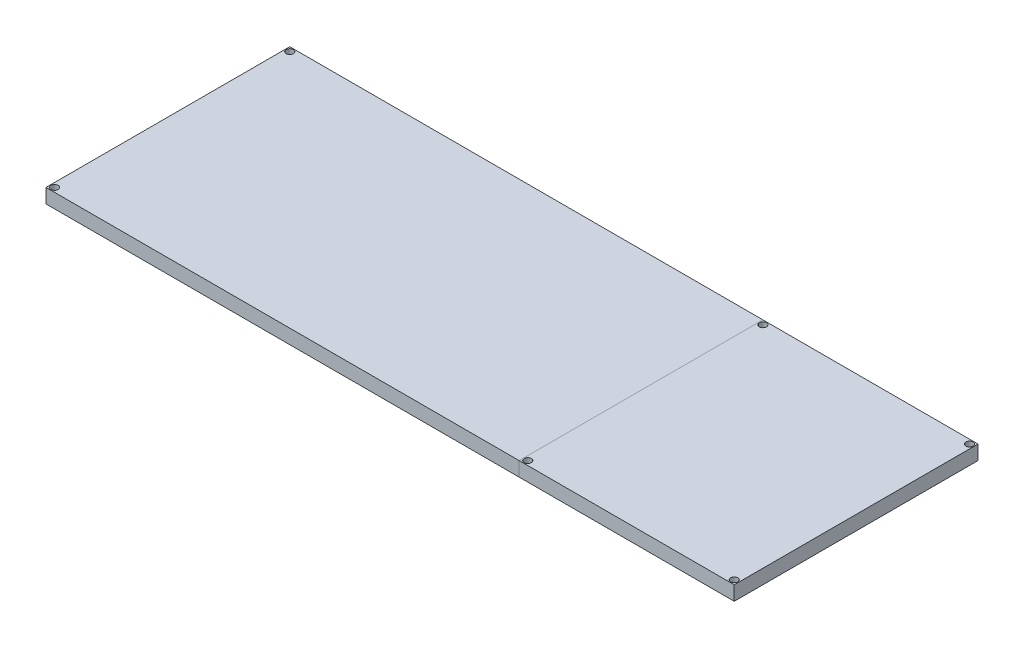
ISO-10303-21;
HEADER;
FILE_DESCRIPTION(('STEP AP214'),'2;1');
FILE_NAME('part.step','',(''),(''),'','','');
FILE_SCHEMA(('AUTOMOTIVE_DESIGN { 1 0 10303 214 1 1 1 1 }'));
ENDSEC;
DATA;
#1=APPLICATION_CONTEXT('core data for automotive mechanical design processes');
#2=APPLICATION_PROTOCOL_DEFINITION('international standard','automotive_design',2000,#1);
#3=PRODUCT_CONTEXT('',#1,'mechanical');
#4=PRODUCT('Part','Part','',(#3));
#5=PRODUCT_RELATED_PRODUCT_CATEGORY('part','',(#4));
#6=PRODUCT_DEFINITION_FORMATION('','',#4);
#7=PRODUCT_DEFINITION_CONTEXT('part definition',#1,'design');
#8=PRODUCT_DEFINITION('design','',#6,#7);
#9=PRODUCT_DEFINITION_SHAPE('','',#8);
#10=(LENGTH_UNIT() NAMED_UNIT(*) SI_UNIT(.MILLI.,.METRE.));
#11=(NAMED_UNIT(*) PLANE_ANGLE_UNIT() SI_UNIT($,.RADIAN.));
#12=(NAMED_UNIT(*) SI_UNIT($,.STERADIAN.) SOLID_ANGLE_UNIT());
#13=UNCERTAINTY_MEASURE_WITH_UNIT(LENGTH_MEASURE(1.E-05),#10,'distance_accuracy_value','');
#14=(GEOMETRIC_REPRESENTATION_CONTEXT(3) GLOBAL_UNCERTAINTY_ASSIGNED_CONTEXT((#13)) GLOBAL_UNIT_ASSIGNED_CONTEXT((#10,
#11,#12)) REPRESENTATION_CONTEXT('',''));
#15=CARTESIAN_POINT('',(0.,0.,0.));
#16=DIRECTION('',(0.,0.,1.));
#17=DIRECTION('',(1.,0.,0.));
#18=AXIS2_PLACEMENT_3D('',#15,#16,#17);
#19=CARTESIAN_POINT('',(-165.,5.,-85.));
#20=DIRECTION('',(0.,0.,1.));
#21=DIRECTION('',(1.,0.,0.));
#22=AXIS2_PLACEMENT_3D('',#19,#20,#21);
#23=PLANE('',#22);
#24=DIRECTION('',(0.,-1.,0.));
#25=VECTOR('',#24,1.);
#26=CARTESIAN_POINT('',(0.,5.,-85.));
#27=LINE('',#26,#25);
#28=CARTESIAN_POINT('',(0.,5.,-85.));
#29=VERTEX_POINT('',#28);
#30=CARTESIAN_POINT('',(0.,0.,-85.));
#31=VERTEX_POINT('',#30);
#32=EDGE_CURVE('E111',#29,#31,#27,.T.);
#33=ORIENTED_EDGE('',*,*,#32,.T.);
#34=DIRECTION('',(1.,0.,0.));
#35=VECTOR('',#34,1.);
#36=CARTESIAN_POINT('',(-165.,0.,-85.));
#37=LINE('',#36,#35);
#38=CARTESIAN_POINT('',(-165.,0.,-85.));
#39=VERTEX_POINT('',#38);
#40=EDGE_CURVE('E12',#39,#31,#37,.T.);
#41=ORIENTED_EDGE('',*,*,#40,.F.);
#42=DIRECTION('',(0.,-1.,0.));
#43=VECTOR('',#42,1.);
#44=CARTESIAN_POINT('',(-165.,5.,-85.));
#45=LINE('',#44,#43);
#46=CARTESIAN_POINT('',(-165.,5.,-85.));
#47=VERTEX_POINT('',#46);
#48=EDGE_CURVE('E99',#47,#39,#45,.T.);
#49=ORIENTED_EDGE('',*,*,#48,.F.);
#50=DIRECTION('',(1.,0.,0.));
#51=VECTOR('',#50,1.);
#52=CARTESIAN_POINT('',(-165.,5.,-85.));
#53=LINE('',#52,#51);
#54=EDGE_CURVE('E107',#47,#29,#53,.T.);
#55=ORIENTED_EDGE('',*,*,#54,.T.);
#56=EDGE_LOOP('',(#33,#41,#49,#55));
#57=FACE_BOUND('',#56,.T.);
#58=ADVANCED_FACE('F48',(#57),#23,.F.);
#59=CARTESIAN_POINT('',(-165.,0.,-85.));
#60=DIRECTION('',(0.,1.,0.));
#61=DIRECTION('',(0.,0.,1.));
#62=AXIS2_PLACEMENT_3D('',#59,#60,#61);
#63=PLANE('',#62);
#64=CARTESIAN_POINT('',(-163.5,0.,-1.5));
#65=DIRECTION('',(0.,1.,0.));
#66=DIRECTION('',(0.,0.,1.));
#67=AXIS2_PLACEMENT_3D('',#64,#65,#66);
#68=CIRCLE('',#67,1.25000000000001);
#69=CARTESIAN_POINT('',(-163.5,0.,-0.24999999999999));
#70=VERTEX_POINT('',#69);
#71=EDGE_CURVE('E114',#70,#70,#68,.T.);
#72=ORIENTED_EDGE('',*,*,#71,.T.);
#73=EDGE_LOOP('',(#72));
#74=FACE_BOUND('',#73,.T.);
#75=CARTESIAN_POINT('',(-163.5,0.,-83.5));
#76=DIRECTION('',(0.,1.,0.));
#77=DIRECTION('',(0.,0.,1.));
#78=AXIS2_PLACEMENT_3D('',#75,#76,#77);
#79=CIRCLE('',#78,1.25000000000001);
#80=CARTESIAN_POINT('',(-163.5,0.,-82.25));
#81=VERTEX_POINT('',#80);
#82=EDGE_CURVE('E128',#81,#81,#79,.T.);
#83=ORIENTED_EDGE('',*,*,#82,.T.);
#84=EDGE_LOOP('',(#83));
#85=FACE_BOUND('',#84,.T.);
#86=DIRECTION('',(0.,0.,1.));
#87=VECTOR('',#86,1.);
#88=CARTESIAN_POINT('',(0.,0.,-85.));
#89=LINE('',#88,#87);
#90=CARTESIAN_POINT('',(0.,0.,0.));
#91=VERTEX_POINT('',#90);
#92=EDGE_CURVE('E103',#31,#91,#89,.T.);
#93=ORIENTED_EDGE('',*,*,#92,.T.);
#94=DIRECTION('',(1.,0.,0.));
#95=VECTOR('',#94,1.);
#96=CARTESIAN_POINT('',(-165.,0.,0.));
#97=LINE('',#96,#95);
#98=CARTESIAN_POINT('',(-165.,0.,0.));
#99=VERTEX_POINT('',#98);
#100=EDGE_CURVE('E56',#99,#91,#97,.T.);
#101=ORIENTED_EDGE('',*,*,#100,.F.);
#102=DIRECTION('',(0.,0.,1.));
#103=VECTOR('',#102,1.);
#104=CARTESIAN_POINT('',(-165.,0.,-85.));
#105=LINE('',#104,#103);
#106=EDGE_CURVE('E94',#39,#99,#105,.T.);
#107=ORIENTED_EDGE('',*,*,#106,.F.);
#108=ORIENTED_EDGE('',*,*,#40,.T.);
#109=EDGE_LOOP('',(#93,#101,#107,#108));
#110=FACE_BOUND('',#109,.T.);
#111=ADVANCED_FACE('F102',(#74,#85,#110),#63,.F.);
#112=CARTESIAN_POINT('',(-165.,5.,0.));
#113=DIRECTION('',(0.,0.,-1.));
#114=DIRECTION('',(-1.,0.,0.));
#115=AXIS2_PLACEMENT_3D('',#112,#113,#114);
#116=PLANE('',#115);
#117=DIRECTION('',(0.,1.,0.));
#118=VECTOR('',#117,1.);
#119=CARTESIAN_POINT('',(0.,5.,0.));
#120=LINE('',#119,#118);
#121=CARTESIAN_POINT('',(0.,5.,0.));
#122=VERTEX_POINT('',#121);
#123=EDGE_CURVE('E81',#91,#122,#120,.T.);
#124=ORIENTED_EDGE('',*,*,#123,.T.);
#125=DIRECTION('',(1.,0.,0.));
#126=VECTOR('',#125,1.);
#127=CARTESIAN_POINT('',(-165.,5.,0.));
#128=LINE('',#127,#126);
#129=CARTESIAN_POINT('',(-165.,5.,0.));
#130=VERTEX_POINT('',#129);
#131=EDGE_CURVE('E104',#130,#122,#128,.T.);
#132=ORIENTED_EDGE('',*,*,#131,.F.);
#133=DIRECTION('',(0.,1.,0.));
#134=VECTOR('',#133,1.);
#135=CARTESIAN_POINT('',(-165.,5.,0.));
#136=LINE('',#135,#134);
#137=EDGE_CURVE('E97',#99,#130,#136,.T.);
#138=ORIENTED_EDGE('',*,*,#137,.F.);
#139=ORIENTED_EDGE('',*,*,#100,.T.);
#140=EDGE_LOOP('',(#124,#132,#138,#139));
#141=FACE_BOUND('',#140,.T.);
#142=ADVANCED_FACE('F105',(#141),#116,.F.);
#143=CARTESIAN_POINT('',(-165.,5.,-85.));
#144=DIRECTION('',(0.,-1.,0.));
#145=DIRECTION('',(0.,0.,-1.));
#146=AXIS2_PLACEMENT_3D('',#143,#144,#145);
#147=PLANE('',#146);
#148=CARTESIAN_POINT('',(-163.5,5.,-1.5));
#149=DIRECTION('',(0.,1.,0.));
#150=DIRECTION('',(0.,0.,1.));
#151=AXIS2_PLACEMENT_3D('',#148,#149,#150);
#152=CIRCLE('',#151,1.25000000000001);
#153=CARTESIAN_POINT('',(-163.5,5.,-0.24999999999999));
#154=VERTEX_POINT('',#153);
#155=EDGE_CURVE('E131',#154,#154,#152,.T.);
#156=ORIENTED_EDGE('',*,*,#155,.F.);
#157=EDGE_LOOP('',(#156));
#158=FACE_BOUND('',#157,.T.);
#159=CARTESIAN_POINT('',(-163.5,5.,-83.5));
#160=DIRECTION('',(0.,1.,0.));
#161=DIRECTION('',(0.,0.,1.));
#162=AXIS2_PLACEMENT_3D('',#159,#160,#161);
#163=CIRCLE('',#162,1.25000000000001);
#164=CARTESIAN_POINT('',(-163.5,5.,-82.25));
#165=VERTEX_POINT('',#164);
#166=EDGE_CURVE('E125',#165,#165,#163,.T.);
#167=ORIENTED_EDGE('',*,*,#166,.F.);
#168=EDGE_LOOP('',(#167));
#169=FACE_BOUND('',#168,.T.);
#170=DIRECTION('',(0.,0.,-1.));
#171=VECTOR('',#170,1.);
#172=CARTESIAN_POINT('',(0.,5.,-85.));
#173=LINE('',#172,#171);
#174=EDGE_CURVE('E87',#122,#29,#173,.T.);
#175=ORIENTED_EDGE('',*,*,#174,.T.);
#176=ORIENTED_EDGE('',*,*,#54,.F.);
#177=DIRECTION('',(0.,0.,-1.));
#178=VECTOR('',#177,1.);
#179=CARTESIAN_POINT('',(-165.,5.,-85.));
#180=LINE('',#179,#178);
#181=EDGE_CURVE('E64',#130,#47,#180,.T.);
#182=ORIENTED_EDGE('',*,*,#181,.F.);
#183=ORIENTED_EDGE('',*,*,#131,.T.);
#184=EDGE_LOOP('',(#175,#176,#182,#183));
#185=FACE_BOUND('',#184,.T.);
#186=ADVANCED_FACE('F119',(#158,#169,#185),#147,.F.);
#187=CARTESIAN_POINT('',(-165.,0.,0.));
#188=DIRECTION('',(-1.,0.,0.));
#189=DIRECTION('',(0.,0.,1.));
#190=AXIS2_PLACEMENT_3D('',#187,#188,#189);
#191=PLANE('',#190);
#192=ORIENTED_EDGE('',*,*,#48,.T.);
#193=ORIENTED_EDGE('',*,*,#106,.T.);
#194=ORIENTED_EDGE('',*,*,#137,.T.);
#195=ORIENTED_EDGE('',*,*,#181,.T.);
#196=EDGE_LOOP('',(#192,#193,#194,#195));
#197=FACE_BOUND('',#196,.T.);
#198=ADVANCED_FACE('F95',(#197),#191,.T.);
#199=CARTESIAN_POINT('',(0.,0.,0.));
#200=DIRECTION('',(-1.,0.,0.));
#201=DIRECTION('',(0.,0.,1.));
#202=AXIS2_PLACEMENT_3D('',#199,#200,#201);
#203=PLANE('',#202);
#204=ORIENTED_EDGE('',*,*,#32,.F.);
#205=ORIENTED_EDGE('',*,*,#174,.F.);
#206=ORIENTED_EDGE('',*,*,#123,.F.);
#207=ORIENTED_EDGE('',*,*,#92,.F.);
#208=EDGE_LOOP('',(#204,#205,#206,#207));
#209=FACE_BOUND('',#208,.T.);
#210=ADVANCED_FACE('F122',(#209),#203,.F.);
#211=CARTESIAN_POINT('',(-163.5,0.,-83.5));
#212=DIRECTION('',(0.,1.,0.));
#213=DIRECTION('',(0.,0.,1.));
#214=AXIS2_PLACEMENT_3D('',#211,#212,#213);
#215=CYLINDRICAL_SURFACE('',#214,1.25000000000001);
#216=ORIENTED_EDGE('',*,*,#82,.F.);
#217=EDGE_LOOP('',(#216));
#218=FACE_BOUND('',#217,.T.);
#219=ORIENTED_EDGE('',*,*,#166,.T.);
#220=EDGE_LOOP('',(#219));
#221=FACE_BOUND('',#220,.T.);
#222=ADVANCED_FACE('F142',(#218,#221),#215,.F.);
#223=CARTESIAN_POINT('',(-163.5,0.,-1.5));
#224=DIRECTION('',(0.,1.,0.));
#225=DIRECTION('',(0.,0.,1.));
#226=AXIS2_PLACEMENT_3D('',#223,#224,#225);
#227=CYLINDRICAL_SURFACE('',#226,1.25000000000001);
#228=ORIENTED_EDGE('',*,*,#71,.F.);
#229=EDGE_LOOP('',(#228));
#230=FACE_BOUND('',#229,.T.);
#231=ORIENTED_EDGE('',*,*,#155,.T.);
#232=EDGE_LOOP('',(#231));
#233=FACE_BOUND('',#232,.T.);
#234=ADVANCED_FACE('F139',(#230,#233),#227,.F.);
#235=CLOSED_SHELL('',(#58,#111,#142,#186,#198,#210,#222,#234));
#236=MANIFOLD_SOLID_BREP('B2',#235);
#237=CARTESIAN_POINT('',(0.,5.,0.));
#238=DIRECTION('',(1.,0.,0.));
#239=DIRECTION('',(0.,0.,-1.));
#240=AXIS2_PLACEMENT_3D('',#237,#238,#239);
#241=PLANE('',#240);
#242=DIRECTION('',(0.,0.,1.));
#243=VECTOR('',#242,1.);
#244=CARTESIAN_POINT('',(0.,0.,0.));
#245=LINE('',#244,#243);
#246=CARTESIAN_POINT('',(0.,0.,-85.));
#247=VERTEX_POINT('',#246);
#248=CARTESIAN_POINT('',(0.,0.,0.));
#249=VERTEX_POINT('',#248);
#250=EDGE_CURVE('E276',#247,#249,#245,.T.);
#251=ORIENTED_EDGE('',*,*,#250,.T.);
#252=DIRECTION('',(0.,-1.,0.));
#253=VECTOR('',#252,1.);
#254=CARTESIAN_POINT('',(0.,5.,0.));
#255=LINE('',#254,#253);
#256=CARTESIAN_POINT('',(0.,5.,0.));
#257=VERTEX_POINT('',#256);
#258=EDGE_CURVE('E46',#257,#249,#255,.T.);
#259=ORIENTED_EDGE('',*,*,#258,.F.);
#260=DIRECTION('',(0.,0.,1.));
#261=VECTOR('',#260,1.);
#262=CARTESIAN_POINT('',(0.,5.,0.));
#263=LINE('',#262,#261);
#264=CARTESIAN_POINT('',(0.,5.,-85.));
#265=VERTEX_POINT('',#264);
#266=EDGE_CURVE('E264',#265,#257,#263,.T.);
#267=ORIENTED_EDGE('',*,*,#266,.F.);
#268=DIRECTION('',(0.,-1.,0.));
#269=VECTOR('',#268,1.);
#270=CARTESIAN_POINT('',(0.,5.,-85.));
#271=LINE('',#270,#269);
#272=EDGE_CURVE('E272',#265,#247,#271,.T.);
#273=ORIENTED_EDGE('',*,*,#272,.T.);
#274=EDGE_LOOP('',(#251,#259,#267,#273));
#275=FACE_BOUND('',#274,.T.);
#276=ADVANCED_FACE('F213',(#275),#241,.F.);
#277=CARTESIAN_POINT('',(0.,5.,0.));
#278=DIRECTION('',(0.,0.,-1.));
#279=DIRECTION('',(-1.,0.,0.));
#280=AXIS2_PLACEMENT_3D('',#277,#278,#279);
#281=PLANE('',#280);
#282=DIRECTION('',(1.,0.,0.));
#283=VECTOR('',#282,1.);
#284=CARTESIAN_POINT('',(0.,0.,0.));
#285=LINE('',#284,#283);
#286=CARTESIAN_POINT('',(75.,0.,0.));
#287=VERTEX_POINT('',#286);
#288=EDGE_CURVE('E268',#249,#287,#285,.T.);
#289=ORIENTED_EDGE('',*,*,#288,.T.);
#290=DIRECTION('',(0.,-1.,0.));
#291=VECTOR('',#290,1.);
#292=CARTESIAN_POINT('',(75.,5.,0.));
#293=LINE('',#292,#291);
#294=CARTESIAN_POINT('',(75.,5.,0.));
#295=VERTEX_POINT('',#294);
#296=EDGE_CURVE('E221',#295,#287,#293,.T.);
#297=ORIENTED_EDGE('',*,*,#296,.F.);
#298=DIRECTION('',(1.,0.,0.));
#299=VECTOR('',#298,1.);
#300=CARTESIAN_POINT('',(0.,5.,0.));
#301=LINE('',#300,#299);
#302=EDGE_CURVE('E259',#257,#295,#301,.T.);
#303=ORIENTED_EDGE('',*,*,#302,.F.);
#304=ORIENTED_EDGE('',*,*,#258,.T.);
#305=EDGE_LOOP('',(#289,#297,#303,#304));
#306=FACE_BOUND('',#305,.T.);
#307=ADVANCED_FACE('F267',(#306),#281,.F.);
#308=CARTESIAN_POINT('',(75.,5.,0.));
#309=DIRECTION('',(-1.,0.,0.));
#310=DIRECTION('',(0.,0.,1.));
#311=AXIS2_PLACEMENT_3D('',#308,#309,#310);
#312=PLANE('',#311);
#313=DIRECTION('',(0.,0.,-1.));
#314=VECTOR('',#313,1.);
#315=CARTESIAN_POINT('',(75.,0.,0.));
#316=LINE('',#315,#314);
#317=CARTESIAN_POINT('',(75.,0.,-85.));
#318=VERTEX_POINT('',#317);
#319=EDGE_CURVE('E246',#287,#318,#316,.T.);
#320=ORIENTED_EDGE('',*,*,#319,.T.);
#321=DIRECTION('',(0.,-1.,0.));
#322=VECTOR('',#321,1.);
#323=CARTESIAN_POINT('',(75.,5.,-85.));
#324=LINE('',#323,#322);
#325=CARTESIAN_POINT('',(75.,5.,-85.));
#326=VERTEX_POINT('',#325);
#327=EDGE_CURVE('E269',#326,#318,#324,.T.);
#328=ORIENTED_EDGE('',*,*,#327,.F.);
#329=DIRECTION('',(0.,0.,-1.));
#330=VECTOR('',#329,1.);
#331=CARTESIAN_POINT('',(75.,5.,0.));
#332=LINE('',#331,#330);
#333=EDGE_CURVE('E262',#295,#326,#332,.T.);
#334=ORIENTED_EDGE('',*,*,#333,.F.);
#335=ORIENTED_EDGE('',*,*,#296,.T.);
#336=EDGE_LOOP('',(#320,#328,#334,#335));
#337=FACE_BOUND('',#336,.T.);
#338=ADVANCED_FACE('F270',(#337),#312,.F.);
#339=CARTESIAN_POINT('',(0.,5.,-85.));
#340=DIRECTION('',(0.,0.,1.));
#341=DIRECTION('',(1.,0.,0.));
#342=AXIS2_PLACEMENT_3D('',#339,#340,#341);
#343=PLANE('',#342);
#344=DIRECTION('',(-1.,0.,0.));
#345=VECTOR('',#344,1.);
#346=CARTESIAN_POINT('',(0.,0.,-85.));
#347=LINE('',#346,#345);
#348=EDGE_CURVE('E252',#318,#247,#347,.T.);
#349=ORIENTED_EDGE('',*,*,#348,.T.);
#350=ORIENTED_EDGE('',*,*,#272,.F.);
#351=DIRECTION('',(-1.,0.,0.));
#352=VECTOR('',#351,1.);
#353=CARTESIAN_POINT('',(0.,5.,-85.));
#354=LINE('',#353,#352);
#355=EDGE_CURVE('E229',#326,#265,#354,.T.);
#356=ORIENTED_EDGE('',*,*,#355,.F.);
#357=ORIENTED_EDGE('',*,*,#327,.T.);
#358=EDGE_LOOP('',(#349,#350,#356,#357));
#359=FACE_BOUND('',#358,.T.);
#360=ADVANCED_FACE('F284',(#359),#343,.F.);
#361=CARTESIAN_POINT('',(0.,5.,0.));
#362=DIRECTION('',(0.,-1.,0.));
#363=DIRECTION('',(0.,0.,-1.));
#364=AXIS2_PLACEMENT_3D('',#361,#362,#363);
#365=PLANE('',#364);
#366=CARTESIAN_POINT('',(1.49999999999992,5.,-83.5));
#367=DIRECTION('',(0.,1.,0.));
#368=DIRECTION('',(0.,0.,1.));
#369=AXIS2_PLACEMENT_3D('',#366,#367,#368);
#370=CIRCLE('',#369,1.25);
#371=CARTESIAN_POINT('',(1.49999999999992,5.,-82.25));
#372=VERTEX_POINT('',#371);
#373=EDGE_CURVE('E296',#372,#372,#370,.T.);
#374=ORIENTED_EDGE('',*,*,#373,.F.);
#375=EDGE_LOOP('',(#374));
#376=FACE_BOUND('',#375,.T.);
#377=CARTESIAN_POINT('',(73.4999999999999,5.,-83.5));
#378=DIRECTION('',(0.,1.,0.));
#379=DIRECTION('',(0.,0.,1.));
#380=AXIS2_PLACEMENT_3D('',#377,#378,#379);
#381=CIRCLE('',#380,1.25);
#382=CARTESIAN_POINT('',(73.4999999999999,5.,-82.25));
#383=VERTEX_POINT('',#382);
#384=EDGE_CURVE('E302',#383,#383,#381,.T.);
#385=ORIENTED_EDGE('',*,*,#384,.F.);
#386=EDGE_LOOP('',(#385));
#387=FACE_BOUND('',#386,.T.);
#388=CARTESIAN_POINT('',(73.5,5.,-1.5));
#389=DIRECTION('',(0.,1.,0.));
#390=DIRECTION('',(0.,0.,1.));
#391=AXIS2_PLACEMENT_3D('',#388,#389,#390);
#392=CIRCLE('',#391,1.25);
#393=CARTESIAN_POINT('',(73.5,5.,-0.250000000000004));
#394=VERTEX_POINT('',#393);
#395=EDGE_CURVE('E308',#394,#394,#392,.T.);
#396=ORIENTED_EDGE('',*,*,#395,.F.);
#397=EDGE_LOOP('',(#396));
#398=FACE_BOUND('',#397,.T.);
#399=CARTESIAN_POINT('',(1.5,5.,-1.5));
#400=DIRECTION('',(0.,1.,0.));
#401=DIRECTION('',(0.,0.,1.));
#402=AXIS2_PLACEMENT_3D('',#399,#400,#401);
#403=CIRCLE('',#402,1.25);
#404=CARTESIAN_POINT('',(1.5,5.,-0.250000000000002));
#405=VERTEX_POINT('',#404);
#406=EDGE_CURVE('E290',#405,#405,#403,.T.);
#407=ORIENTED_EDGE('',*,*,#406,.F.);
#408=EDGE_LOOP('',(#407));
#409=FACE_BOUND('',#408,.T.);
#410=ORIENTED_EDGE('',*,*,#266,.T.);
#411=ORIENTED_EDGE('',*,*,#302,.T.);
#412=ORIENTED_EDGE('',*,*,#333,.T.);
#413=ORIENTED_EDGE('',*,*,#355,.T.);
#414=EDGE_LOOP('',(#410,#411,#412,#413));
#415=FACE_BOUND('',#414,.T.);
#416=ADVANCED_FACE('F260',(#376,#387,#398,#409,#415),#365,.F.);
#417=CARTESIAN_POINT('',(0.,0.,0.));
#418=DIRECTION('',(0.,-1.,0.));
#419=DIRECTION('',(0.,0.,-1.));
#420=AXIS2_PLACEMENT_3D('',#417,#418,#419);
#421=PLANE('',#420);
#422=CARTESIAN_POINT('',(1.49999999999992,0.,-83.5));
#423=DIRECTION('',(0.,1.,0.));
#424=DIRECTION('',(0.,0.,1.));
#425=AXIS2_PLACEMENT_3D('',#422,#423,#424);
#426=CIRCLE('',#425,1.25);
#427=CARTESIAN_POINT('',(1.49999999999992,0.,-82.25));
#428=VERTEX_POINT('',#427);
#429=EDGE_CURVE('E299',#428,#428,#426,.T.);
#430=ORIENTED_EDGE('',*,*,#429,.T.);
#431=EDGE_LOOP('',(#430));
#432=FACE_BOUND('',#431,.T.);
#433=CARTESIAN_POINT('',(73.4999999999999,0.,-83.5));
#434=DIRECTION('',(0.,1.,0.));
#435=DIRECTION('',(0.,0.,1.));
#436=AXIS2_PLACEMENT_3D('',#433,#434,#435);
#437=CIRCLE('',#436,1.25);
#438=CARTESIAN_POINT('',(73.4999999999999,0.,-82.25));
#439=VERTEX_POINT('',#438);
#440=EDGE_CURVE('E305',#439,#439,#437,.T.);
#441=ORIENTED_EDGE('',*,*,#440,.T.);
#442=EDGE_LOOP('',(#441));
#443=FACE_BOUND('',#442,.T.);
#444=CARTESIAN_POINT('',(73.5,0.,-1.5));
#445=DIRECTION('',(0.,1.,0.));
#446=DIRECTION('',(0.,0.,1.));
#447=AXIS2_PLACEMENT_3D('',#444,#445,#446);
#448=CIRCLE('',#447,1.25);
#449=CARTESIAN_POINT('',(73.5,0.,-0.250000000000004));
#450=VERTEX_POINT('',#449);
#451=EDGE_CURVE('E293',#450,#450,#448,.T.);
#452=ORIENTED_EDGE('',*,*,#451,.T.);
#453=EDGE_LOOP('',(#452));
#454=FACE_BOUND('',#453,.T.);
#455=CARTESIAN_POINT('',(1.5,0.,-1.5));
#456=DIRECTION('',(0.,1.,0.));
#457=DIRECTION('',(0.,0.,1.));
#458=AXIS2_PLACEMENT_3D('',#455,#456,#457);
#459=CIRCLE('',#458,1.25);
#460=CARTESIAN_POINT('',(1.5,0.,-0.250000000000002));
#461=VERTEX_POINT('',#460);
#462=EDGE_CURVE('E279',#461,#461,#459,.T.);
#463=ORIENTED_EDGE('',*,*,#462,.T.);
#464=EDGE_LOOP('',(#463));
#465=FACE_BOUND('',#464,.T.);
#466=ORIENTED_EDGE('',*,*,#250,.F.);
#467=ORIENTED_EDGE('',*,*,#348,.F.);
#468=ORIENTED_EDGE('',*,*,#319,.F.);
#469=ORIENTED_EDGE('',*,*,#288,.F.);
#470=EDGE_LOOP('',(#466,#467,#468,#469));
#471=FACE_BOUND('',#470,.T.);
#472=ADVANCED_FACE('F287',(#432,#443,#454,#465,#471),#421,.T.);
#473=CARTESIAN_POINT('',(1.5,0.,-1.5));
#474=DIRECTION('',(0.,1.,0.));
#475=DIRECTION('',(0.,0.,1.));
#476=AXIS2_PLACEMENT_3D('',#473,#474,#475);
#477=CYLINDRICAL_SURFACE('',#476,1.25);
#478=ORIENTED_EDGE('',*,*,#462,.F.);
#479=EDGE_LOOP('',(#478));
#480=FACE_BOUND('',#479,.T.);
#481=ORIENTED_EDGE('',*,*,#406,.T.);
#482=EDGE_LOOP('',(#481));
#483=FACE_BOUND('',#482,.T.);
#484=ADVANCED_FACE('F320',(#480,#483),#477,.F.);
#485=CARTESIAN_POINT('',(73.5,0.,-1.5));
#486=DIRECTION('',(0.,1.,0.));
#487=DIRECTION('',(0.,0.,1.));
#488=AXIS2_PLACEMENT_3D('',#485,#486,#487);
#489=CYLINDRICAL_SURFACE('',#488,1.25);
#490=ORIENTED_EDGE('',*,*,#451,.F.);
#491=EDGE_LOOP('',(#490));
#492=FACE_BOUND('',#491,.T.);
#493=ORIENTED_EDGE('',*,*,#395,.T.);
#494=EDGE_LOOP('',(#493));
#495=FACE_BOUND('',#494,.T.);
#496=ADVANCED_FACE('F316',(#492,#495),#489,.F.);
#497=CARTESIAN_POINT('',(73.4999999999999,0.,-83.5));
#498=DIRECTION('',(0.,1.,0.));
#499=DIRECTION('',(0.,0.,1.));
#500=AXIS2_PLACEMENT_3D('',#497,#498,#499);
#501=CYLINDRICAL_SURFACE('',#500,1.25);
#502=ORIENTED_EDGE('',*,*,#440,.F.);
#503=EDGE_LOOP('',(#502));
#504=FACE_BOUND('',#503,.T.);
#505=ORIENTED_EDGE('',*,*,#384,.T.);
#506=EDGE_LOOP('',(#505));
#507=FACE_BOUND('',#506,.T.);
#508=ADVANCED_FACE('F319',(#504,#507),#501,.F.);
#509=CARTESIAN_POINT('',(1.49999999999992,0.,-83.5));
#510=DIRECTION('',(0.,1.,0.));
#511=DIRECTION('',(0.,0.,1.));
#512=AXIS2_PLACEMENT_3D('',#509,#510,#511);
#513=CYLINDRICAL_SURFACE('',#512,1.25);
#514=ORIENTED_EDGE('',*,*,#429,.F.);
#515=EDGE_LOOP('',(#514));
#516=FACE_BOUND('',#515,.T.);
#517=ORIENTED_EDGE('',*,*,#373,.T.);
#518=EDGE_LOOP('',(#517));
#519=FACE_BOUND('',#518,.T.);
#520=ADVANCED_FACE('F381',(#516,#519),#513,.F.);
#521=CLOSED_SHELL('',(#276,#307,#338,#360,#416,#472,#484,#496,#508,#520));
#522=MANIFOLD_SOLID_BREP('B6',#521);
#523=ADVANCED_BREP_SHAPE_REPRESENTATION('',(#18,#236,#522),#14);
#524=SHAPE_DEFINITION_REPRESENTATION(#9,#523);
ENDSEC;
END-ISO-10303-21;
